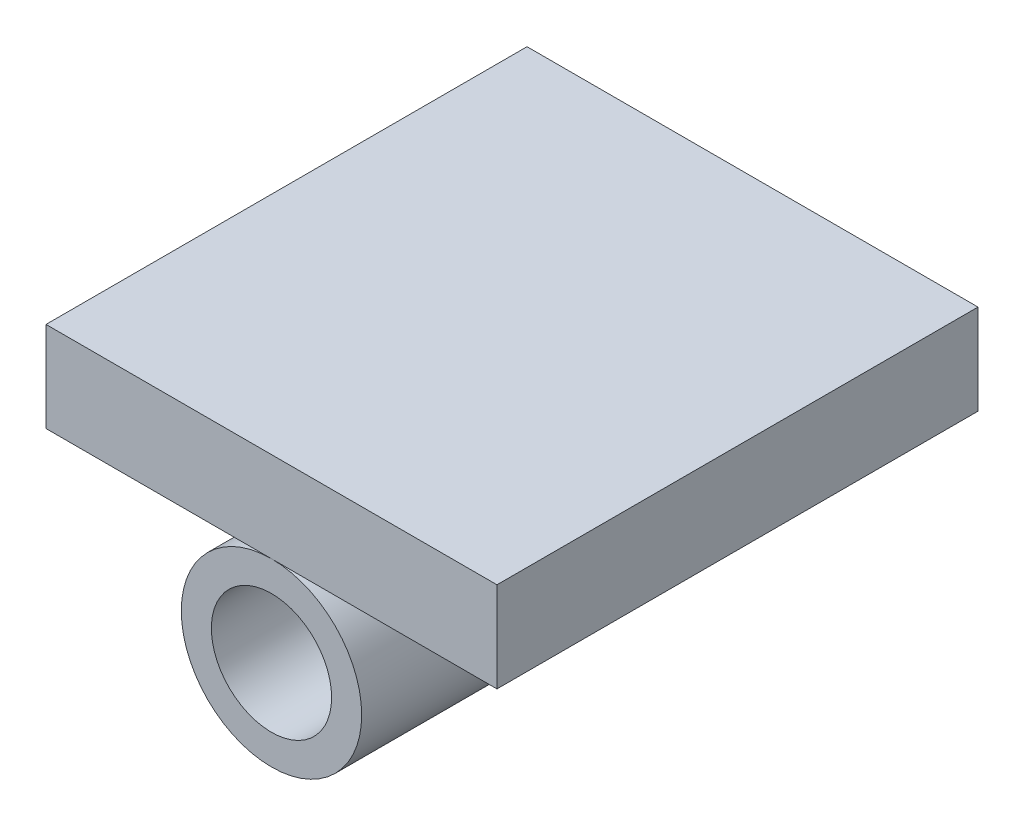
ISO-10303-21;
HEADER;
FILE_DESCRIPTION(('STEP AP214'),'2;1');
FILE_NAME('part.step','',(''),(''),'','','');
FILE_SCHEMA(('AUTOMOTIVE_DESIGN { 1 0 10303 214 1 1 1 1 }'));
ENDSEC;
DATA;
#1=APPLICATION_CONTEXT('core data for automotive mechanical design processes');
#2=APPLICATION_PROTOCOL_DEFINITION('international standard','automotive_design',2000,#1);
#3=PRODUCT_CONTEXT('',#1,'mechanical');
#4=PRODUCT('Part','Part','',(#3));
#5=PRODUCT_RELATED_PRODUCT_CATEGORY('part','',(#4));
#6=PRODUCT_DEFINITION_FORMATION('','',#4);
#7=PRODUCT_DEFINITION_CONTEXT('part definition',#1,'design');
#8=PRODUCT_DEFINITION('design','',#6,#7);
#9=PRODUCT_DEFINITION_SHAPE('','',#8);
#10=(LENGTH_UNIT() NAMED_UNIT(*) SI_UNIT(.MILLI.,.METRE.));
#11=(NAMED_UNIT(*) PLANE_ANGLE_UNIT() SI_UNIT($,.RADIAN.));
#12=(NAMED_UNIT(*) SI_UNIT($,.STERADIAN.) SOLID_ANGLE_UNIT());
#13=UNCERTAINTY_MEASURE_WITH_UNIT(LENGTH_MEASURE(1.E-05),#10,'distance_accuracy_value','');
#14=(GEOMETRIC_REPRESENTATION_CONTEXT(3) GLOBAL_UNCERTAINTY_ASSIGNED_CONTEXT((#13)) GLOBAL_UNIT_ASSIGNED_CONTEXT((#10,
#11,#12)) REPRESENTATION_CONTEXT('',''));
#15=CARTESIAN_POINT('',(0.,0.,0.));
#16=DIRECTION('',(0.,0.,1.));
#17=DIRECTION('',(1.,0.,0.));
#18=AXIS2_PLACEMENT_3D('',#15,#16,#17);
#19=CARTESIAN_POINT('',(-75.,60.,-80.));
#20=DIRECTION('',(1.,0.,0.));
#21=DIRECTION('',(0.,0.,-1.));
#22=AXIS2_PLACEMENT_3D('',#19,#20,#21);
#23=PLANE('',#22);
#24=DIRECTION('',(0.,0.,1.));
#25=VECTOR('',#24,1.);
#26=CARTESIAN_POINT('',(-75.,30.,-80.));
#27=LINE('',#26,#25);
#28=CARTESIAN_POINT('',(-75.,30.,-80.));
#29=VERTEX_POINT('',#28);
#30=CARTESIAN_POINT('',(-75.,30.,80.));
#31=VERTEX_POINT('',#30);
#32=EDGE_CURVE('E104',#29,#31,#27,.T.);
#33=ORIENTED_EDGE('',*,*,#32,.T.);
#34=DIRECTION('',(0.,-1.,0.));
#35=VECTOR('',#34,1.);
#36=CARTESIAN_POINT('',(-75.,60.,80.));
#37=LINE('',#36,#35);
#38=CARTESIAN_POINT('',(-75.,60.,80.));
#39=VERTEX_POINT('',#38);
#40=EDGE_CURVE('E12',#39,#31,#37,.T.);
#41=ORIENTED_EDGE('',*,*,#40,.F.);
#42=DIRECTION('',(0.,0.,1.));
#43=VECTOR('',#42,1.);
#44=CARTESIAN_POINT('',(-75.,60.,-80.));
#45=LINE('',#44,#43);
#46=CARTESIAN_POINT('',(-75.,60.,-80.));
#47=VERTEX_POINT('',#46);
#48=EDGE_CURVE('E92',#47,#39,#45,.T.);
#49=ORIENTED_EDGE('',*,*,#48,.F.);
#50=DIRECTION('',(0.,-1.,0.));
#51=VECTOR('',#50,1.);
#52=CARTESIAN_POINT('',(-75.,60.,-80.));
#53=LINE('',#52,#51);
#54=EDGE_CURVE('E100',#47,#29,#53,.T.);
#55=ORIENTED_EDGE('',*,*,#54,.T.);
#56=EDGE_LOOP('',(#33,#41,#49,#55));
#57=FACE_BOUND('',#56,.T.);
#58=ADVANCED_FACE('F41',(#57),#23,.F.);
#59=CARTESIAN_POINT('',(-75.,60.,80.));
#60=DIRECTION('',(0.,0.,-1.));
#61=DIRECTION('',(-1.,0.,0.));
#62=AXIS2_PLACEMENT_3D('',#59,#60,#61);
#63=PLANE('',#62);
#64=DIRECTION('',(1.,0.,0.));
#65=VECTOR('',#64,1.);
#66=CARTESIAN_POINT('',(-75.,30.,80.));
#67=LINE('',#66,#65);
#68=CARTESIAN_POINT('',(75.,30.,80.));
#69=VERTEX_POINT('',#68);
#70=EDGE_CURVE('E96',#31,#69,#67,.T.);
#71=ORIENTED_EDGE('',*,*,#70,.T.);
#72=DIRECTION('',(0.,-1.,0.));
#73=VECTOR('',#72,1.);
#74=CARTESIAN_POINT('',(75.,60.,80.));
#75=LINE('',#74,#73);
#76=CARTESIAN_POINT('',(75.,60.,80.));
#77=VERTEX_POINT('',#76);
#78=EDGE_CURVE('E49',#77,#69,#75,.T.);
#79=ORIENTED_EDGE('',*,*,#78,.F.);
#80=DIRECTION('',(1.,0.,0.));
#81=VECTOR('',#80,1.);
#82=CARTESIAN_POINT('',(-75.,60.,80.));
#83=LINE('',#82,#81);
#84=EDGE_CURVE('E87',#39,#77,#83,.T.);
#85=ORIENTED_EDGE('',*,*,#84,.F.);
#86=ORIENTED_EDGE('',*,*,#40,.T.);
#87=EDGE_LOOP('',(#71,#79,#85,#86));
#88=FACE_BOUND('',#87,.T.);
#89=ADVANCED_FACE('F95',(#88),#63,.F.);
#90=CARTESIAN_POINT('',(75.,60.,-80.));
#91=DIRECTION('',(-1.,0.,0.));
#92=DIRECTION('',(0.,0.,1.));
#93=AXIS2_PLACEMENT_3D('',#90,#91,#92);
#94=PLANE('',#93);
#95=DIRECTION('',(0.,0.,-1.));
#96=VECTOR('',#95,1.);
#97=CARTESIAN_POINT('',(75.,30.,-80.));
#98=LINE('',#97,#96);
#99=CARTESIAN_POINT('',(75.,30.,-80.));
#100=VERTEX_POINT('',#99);
#101=EDGE_CURVE('E74',#69,#100,#98,.T.);
#102=ORIENTED_EDGE('',*,*,#101,.T.);
#103=DIRECTION('',(0.,-1.,0.));
#104=VECTOR('',#103,1.);
#105=CARTESIAN_POINT('',(75.,60.,-80.));
#106=LINE('',#105,#104);
#107=CARTESIAN_POINT('',(75.,60.,-80.));
#108=VERTEX_POINT('',#107);
#109=EDGE_CURVE('E97',#108,#100,#106,.T.);
#110=ORIENTED_EDGE('',*,*,#109,.F.);
#111=DIRECTION('',(0.,0.,-1.));
#112=VECTOR('',#111,1.);
#113=CARTESIAN_POINT('',(75.,60.,-80.));
#114=LINE('',#113,#112);
#115=EDGE_CURVE('E90',#77,#108,#114,.T.);
#116=ORIENTED_EDGE('',*,*,#115,.F.);
#117=ORIENTED_EDGE('',*,*,#78,.T.);
#118=EDGE_LOOP('',(#102,#110,#116,#117));
#119=FACE_BOUND('',#118,.T.);
#120=ADVANCED_FACE('F98',(#119),#94,.F.);
#121=CARTESIAN_POINT('',(-75.,60.,-80.));
#122=DIRECTION('',(0.,0.,1.));
#123=DIRECTION('',(1.,0.,0.));
#124=AXIS2_PLACEMENT_3D('',#121,#122,#123);
#125=PLANE('',#124);
#126=DIRECTION('',(-1.,0.,0.));
#127=VECTOR('',#126,1.);
#128=CARTESIAN_POINT('',(-75.,30.,-80.));
#129=LINE('',#128,#127);
#130=EDGE_CURVE('E80',#100,#29,#129,.T.);
#131=ORIENTED_EDGE('',*,*,#130,.T.);
#132=ORIENTED_EDGE('',*,*,#54,.F.);
#133=DIRECTION('',(-1.,0.,0.));
#134=VECTOR('',#133,1.);
#135=CARTESIAN_POINT('',(-75.,60.,-80.));
#136=LINE('',#135,#134);
#137=EDGE_CURVE('E57',#108,#47,#136,.T.);
#138=ORIENTED_EDGE('',*,*,#137,.F.);
#139=ORIENTED_EDGE('',*,*,#109,.T.);
#140=EDGE_LOOP('',(#131,#132,#138,#139));
#141=FACE_BOUND('',#140,.T.);
#142=ADVANCED_FACE('F111',(#141),#125,.F.);
#143=CARTESIAN_POINT('',(0.,60.,0.));
#144=DIRECTION('',(0.,1.,0.));
#145=DIRECTION('',(0.,0.,1.));
#146=AXIS2_PLACEMENT_3D('',#143,#144,#145);
#147=PLANE('',#146);
#148=ORIENTED_EDGE('',*,*,#48,.T.);
#149=ORIENTED_EDGE('',*,*,#84,.T.);
#150=ORIENTED_EDGE('',*,*,#115,.T.);
#151=ORIENTED_EDGE('',*,*,#137,.T.);
#152=EDGE_LOOP('',(#148,#149,#150,#151));
#153=FACE_BOUND('',#152,.T.);
#154=ADVANCED_FACE('F88',(#153),#147,.T.);
#155=CARTESIAN_POINT('',(0.,30.,0.));
#156=DIRECTION('',(0.,1.,0.));
#157=DIRECTION('',(0.,0.,1.));
#158=AXIS2_PLACEMENT_3D('',#155,#156,#157);
#159=PLANE('',#158);
#160=ORIENTED_EDGE('',*,*,#32,.F.);
#161=ORIENTED_EDGE('',*,*,#130,.F.);
#162=ORIENTED_EDGE('',*,*,#101,.F.);
#163=ORIENTED_EDGE('',*,*,#70,.F.);
#164=EDGE_LOOP('',(#160,#161,#162,#163));
#165=FACE_BOUND('',#164,.T.);
#166=ADVANCED_FACE('F114',(#165),#159,.F.);
#167=CLOSED_SHELL('',(#58,#89,#120,#142,#154,#166));
#168=MANIFOLD_SOLID_BREP('B2',#167);
#169=CARTESIAN_POINT('',(0.,0.,80.));
#170=DIRECTION('',(0.,0.,1.));
#171=DIRECTION('',(1.,0.,0.));
#172=AXIS2_PLACEMENT_3D('',#169,#170,#171);
#173=PLANE('',#172);
#174=CARTESIAN_POINT('',(0.,0.,80.));
#175=DIRECTION('',(0.,0.,1.));
#176=DIRECTION('',(1.,0.,0.));
#177=AXIS2_PLACEMENT_3D('',#174,#175,#176);
#178=CIRCLE('',#177,30.);
#179=CARTESIAN_POINT('',(30.,0.,80.));
#180=VERTEX_POINT('',#179);
#181=EDGE_CURVE('E40',#180,#180,#178,.T.);
#182=ORIENTED_EDGE('',*,*,#181,.T.);
#183=EDGE_LOOP('',(#182));
#184=FACE_BOUND('',#183,.T.);
#185=CARTESIAN_POINT('',(0.,0.,80.));
#186=DIRECTION('',(0.,0.,1.));
#187=DIRECTION('',(1.,0.,0.));
#188=AXIS2_PLACEMENT_3D('',#185,#186,#187);
#189=CIRCLE('',#188,20.);
#190=CARTESIAN_POINT('',(20.,0.,80.));
#191=VERTEX_POINT('',#190);
#192=EDGE_CURVE('E176',#191,#191,#189,.T.);
#193=ORIENTED_EDGE('',*,*,#192,.F.);
#194=EDGE_LOOP('',(#193));
#195=FACE_BOUND('',#194,.T.);
#196=ADVANCED_FACE('F165',(#184,#195),#173,.T.);
#197=CARTESIAN_POINT('',(0.,0.,-80.));
#198=DIRECTION('',(0.,0.,1.));
#199=DIRECTION('',(1.,0.,0.));
#200=AXIS2_PLACEMENT_3D('',#197,#198,#199);
#201=PLANE('',#200);
#202=CARTESIAN_POINT('',(0.,0.,-80.));
#203=DIRECTION('',(0.,0.,1.));
#204=DIRECTION('',(1.,0.,0.));
#205=AXIS2_PLACEMENT_3D('',#202,#203,#204);
#206=CIRCLE('',#205,30.);
#207=CARTESIAN_POINT('',(30.,0.,-80.));
#208=VERTEX_POINT('',#207);
#209=EDGE_CURVE('E169',#208,#208,#206,.T.);
#210=ORIENTED_EDGE('',*,*,#209,.F.);
#211=EDGE_LOOP('',(#210));
#212=FACE_BOUND('',#211,.T.);
#213=CARTESIAN_POINT('',(0.,0.,-80.));
#214=DIRECTION('',(0.,0.,1.));
#215=DIRECTION('',(1.,0.,0.));
#216=AXIS2_PLACEMENT_3D('',#213,#214,#215);
#217=CIRCLE('',#216,20.);
#218=CARTESIAN_POINT('',(20.,0.,-80.));
#219=VERTEX_POINT('',#218);
#220=EDGE_CURVE('E178',#219,#219,#217,.T.);
#221=ORIENTED_EDGE('',*,*,#220,.T.);
#222=EDGE_LOOP('',(#221));
#223=FACE_BOUND('',#222,.T.);
#224=ADVANCED_FACE('F188',(#212,#223),#201,.F.);
#225=CARTESIAN_POINT('',(0.,0.,80.));
#226=DIRECTION('',(0.,0.,-1.));
#227=DIRECTION('',(-1.,0.,0.));
#228=AXIS2_PLACEMENT_3D('',#225,#226,#227);
#229=CYLINDRICAL_SURFACE('',#228,30.);
#230=ORIENTED_EDGE('',*,*,#181,.F.);
#231=EDGE_LOOP('',(#230));
#232=FACE_BOUND('',#231,.T.);
#233=ORIENTED_EDGE('',*,*,#209,.T.);
#234=EDGE_LOOP('',(#233));
#235=FACE_BOUND('',#234,.T.);
#236=ADVANCED_FACE('F167',(#232,#235),#229,.T.);
#237=CARTESIAN_POINT('',(0.,0.,80.));
#238=DIRECTION('',(0.,0.,-1.));
#239=DIRECTION('',(-1.,0.,0.));
#240=AXIS2_PLACEMENT_3D('',#237,#238,#239);
#241=CYLINDRICAL_SURFACE('',#240,20.);
#242=ORIENTED_EDGE('',*,*,#192,.T.);
#243=EDGE_LOOP('',(#242));
#244=FACE_BOUND('',#243,.T.);
#245=ORIENTED_EDGE('',*,*,#220,.F.);
#246=EDGE_LOOP('',(#245));
#247=FACE_BOUND('',#246,.T.);
#248=ADVANCED_FACE('F184',(#244,#247),#241,.F.);
#249=CLOSED_SHELL('',(#196,#224,#236,#248));
#250=MANIFOLD_SOLID_BREP('B6',#249);
#251=ADVANCED_BREP_SHAPE_REPRESENTATION('',(#18,#168,#250),#14);
#252=SHAPE_DEFINITION_REPRESENTATION(#9,#251);
ENDSEC;
END-ISO-10303-21;
